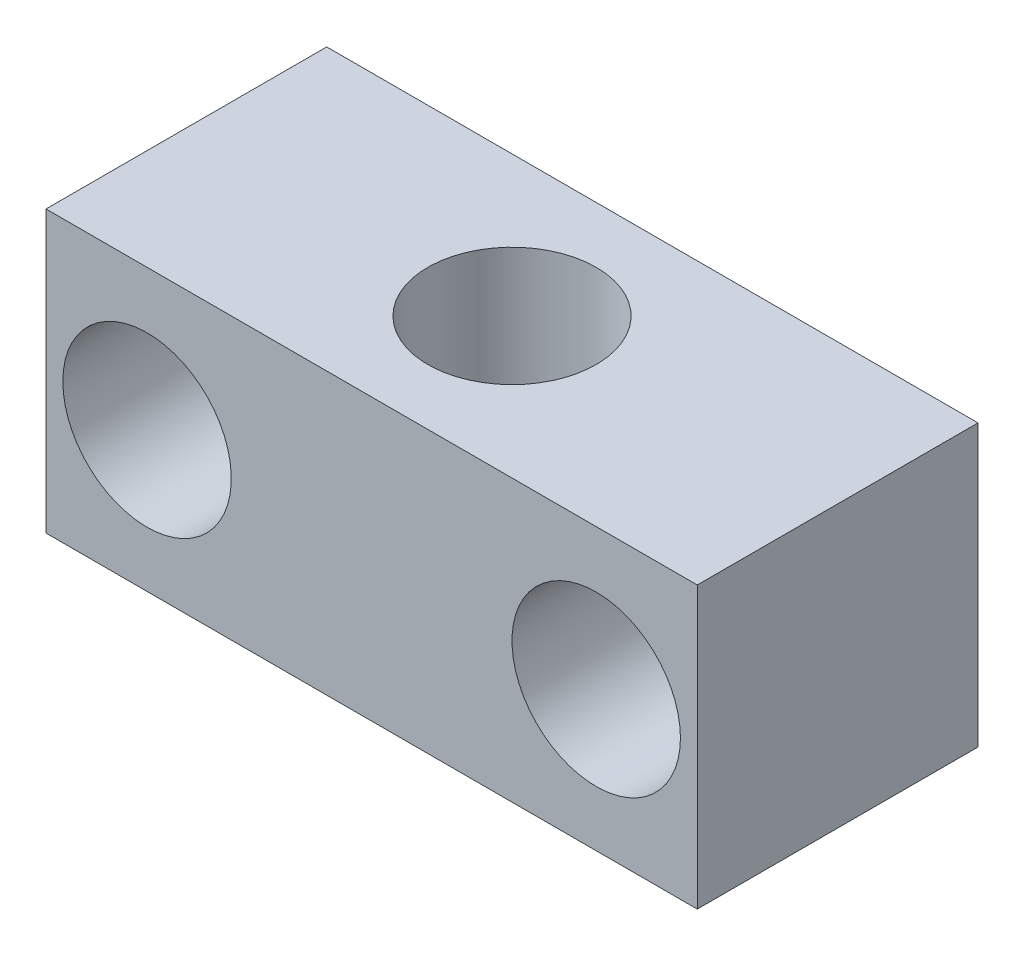
ISO-10303-21;
HEADER;
FILE_DESCRIPTION(('STEP AP214'),'2;1');
FILE_NAME('part.step','',(''),(''),'','','');
FILE_SCHEMA(('AUTOMOTIVE_DESIGN { 1 0 10303 214 1 1 1 1 }'));
ENDSEC;
DATA;
#1=APPLICATION_CONTEXT('core data for automotive mechanical design processes');
#2=APPLICATION_PROTOCOL_DEFINITION('international standard','automotive_design',2000,#1);
#3=PRODUCT_CONTEXT('',#1,'mechanical');
#4=PRODUCT('Part','Part','',(#3));
#5=PRODUCT_RELATED_PRODUCT_CATEGORY('part','',(#4));
#6=PRODUCT_DEFINITION_FORMATION('','',#4);
#7=PRODUCT_DEFINITION_CONTEXT('part definition',#1,'design');
#8=PRODUCT_DEFINITION('design','',#6,#7);
#9=PRODUCT_DEFINITION_SHAPE('','',#8);
#10=(LENGTH_UNIT() NAMED_UNIT(*) SI_UNIT(.MILLI.,.METRE.));
#11=(NAMED_UNIT(*) PLANE_ANGLE_UNIT() SI_UNIT($,.RADIAN.));
#12=(NAMED_UNIT(*) SI_UNIT($,.STERADIAN.) SOLID_ANGLE_UNIT());
#13=UNCERTAINTY_MEASURE_WITH_UNIT(LENGTH_MEASURE(1.E-05),#10,'distance_accuracy_value','');
#14=(GEOMETRIC_REPRESENTATION_CONTEXT(3) GLOBAL_UNCERTAINTY_ASSIGNED_CONTEXT((#13)) GLOBAL_UNIT_ASSIGNED_CONTEXT((#10,
#11,#12)) REPRESENTATION_CONTEXT('',''));
#15=CARTESIAN_POINT('',(0.,0.,0.));
#16=DIRECTION('',(0.,0.,1.));
#17=DIRECTION('',(1.,0.,0.));
#18=AXIS2_PLACEMENT_3D('',#15,#16,#17);
#19=CARTESIAN_POINT('',(-12.2697201424439,1.52496163599194,5.));
#20=DIRECTION('',(1.,0.,0.));
#21=DIRECTION('',(0.,0.,-1.));
#22=AXIS2_PLACEMENT_3D('',#19,#20,#21);
#23=PLANE('',#22);
#24=DIRECTION('',(0.,-1.,0.));
#25=VECTOR('',#24,1.);
#26=CARTESIAN_POINT('',(-12.2697201424439,1.52496163599194,0.));
#27=LINE('',#26,#25);
#28=CARTESIAN_POINT('',(-12.2697201424439,1.52496163599194,0.));
#29=VERTEX_POINT('',#28);
#30=CARTESIAN_POINT('',(-12.2697201424439,-3.47503836400806,0.));
#31=VERTEX_POINT('',#30);
#32=EDGE_CURVE('E85',#29,#31,#27,.T.);
#33=ORIENTED_EDGE('',*,*,#32,.T.);
#34=DIRECTION('',(0.,0.,-1.));
#35=VECTOR('',#34,1.);
#36=CARTESIAN_POINT('',(-12.2697201424439,-3.47503836400806,5.));
#37=LINE('',#36,#35);
#38=CARTESIAN_POINT('',(-12.2697201424439,-3.47503836400806,5.));
#39=VERTEX_POINT('',#38);
#40=EDGE_CURVE('E12',#39,#31,#37,.T.);
#41=ORIENTED_EDGE('',*,*,#40,.F.);
#42=DIRECTION('',(0.,-1.,0.));
#43=VECTOR('',#42,1.);
#44=CARTESIAN_POINT('',(-12.2697201424439,1.52496163599194,5.));
#45=LINE('',#44,#43);
#46=CARTESIAN_POINT('',(-12.2697201424439,1.52496163599194,5.));
#47=VERTEX_POINT('',#46);
#48=EDGE_CURVE('E101',#47,#39,#45,.T.);
#49=ORIENTED_EDGE('',*,*,#48,.F.);
#50=DIRECTION('',(0.,0.,-1.));
#51=VECTOR('',#50,1.);
#52=CARTESIAN_POINT('',(-12.2697201424439,1.52496163599194,5.));
#53=LINE('',#52,#51);
#54=EDGE_CURVE('E91',#47,#29,#53,.T.);
#55=ORIENTED_EDGE('',*,*,#54,.T.);
#56=EDGE_LOOP('',(#33,#41,#49,#55));
#57=FACE_BOUND('',#56,.T.);
#58=ADVANCED_FACE('F33',(#57),#23,.F.);
#59=CARTESIAN_POINT('',(-12.4697201424439,-3.47503836400806,5.));
#60=DIRECTION('',(0.,1.,0.));
#61=DIRECTION('',(0.,0.,1.));
#62=AXIS2_PLACEMENT_3D('',#59,#60,#61);
#63=PLANE('',#62);
#64=CARTESIAN_POINT('',(-6.4697201424439,-3.47503836400806,2.5));
#65=DIRECTION('',(0.,-1.,0.));
#66=DIRECTION('',(0.,0.,-1.));
#67=AXIS2_PLACEMENT_3D('',#64,#65,#66);
#68=CIRCLE('',#67,1.5);
#69=CARTESIAN_POINT('',(-6.4697201424439,-3.47503836400806,0.999999999999999));
#70=VERTEX_POINT('',#69);
#71=EDGE_CURVE('E95',#70,#70,#68,.T.);
#72=ORIENTED_EDGE('',*,*,#71,.F.);
#73=EDGE_LOOP('',(#72));
#74=FACE_BOUND('',#73,.T.);
#75=DIRECTION('',(1.,0.,0.));
#76=VECTOR('',#75,1.);
#77=CARTESIAN_POINT('',(-12.4697201424439,-3.47503836400806,0.));
#78=LINE('',#77,#76);
#79=CARTESIAN_POINT('',(-0.669720142443896,-3.47503836400806,0.));
#80=VERTEX_POINT('',#79);
#81=EDGE_CURVE('E80',#31,#80,#78,.T.);
#82=ORIENTED_EDGE('',*,*,#81,.T.);
#83=DIRECTION('',(0.,0.,-1.));
#84=VECTOR('',#83,1.);
#85=CARTESIAN_POINT('',(-0.669720142443895,-3.47503836400806,5.));
#86=LINE('',#85,#84);
#87=CARTESIAN_POINT('',(-0.669720142443896,-3.47503836400806,5.));
#88=VERTEX_POINT('',#87);
#89=EDGE_CURVE('E41',#88,#80,#86,.T.);
#90=ORIENTED_EDGE('',*,*,#89,.F.);
#91=DIRECTION('',(1.,0.,0.));
#92=VECTOR('',#91,1.);
#93=CARTESIAN_POINT('',(-12.4697201424439,-3.47503836400806,5.));
#94=LINE('',#93,#92);
#95=EDGE_CURVE('E61',#39,#88,#94,.T.);
#96=ORIENTED_EDGE('',*,*,#95,.F.);
#97=ORIENTED_EDGE('',*,*,#40,.T.);
#98=EDGE_LOOP('',(#82,#90,#96,#97));
#99=FACE_BOUND('',#98,.T.);
#100=ADVANCED_FACE('F88',(#74,#99),#63,.F.);
#101=CARTESIAN_POINT('',(-0.669720142443896,1.52496163599194,5.));
#102=DIRECTION('',(-1.,0.,0.));
#103=DIRECTION('',(0.,-1.,0.));
#104=AXIS2_PLACEMENT_3D('',#101,#102,#103);
#105=PLANE('',#104);
#106=DIRECTION('',(0.,1.,0.));
#107=VECTOR('',#106,1.);
#108=CARTESIAN_POINT('',(-0.669720142443896,1.52496163599194,0.));
#109=LINE('',#108,#107);
#110=CARTESIAN_POINT('',(-0.669720142443896,1.52496163599194,0.));
#111=VERTEX_POINT('',#110);
#112=EDGE_CURVE('E76',#80,#111,#109,.T.);
#113=ORIENTED_EDGE('',*,*,#112,.T.);
#114=DIRECTION('',(0.,0.,-1.));
#115=VECTOR('',#114,1.);
#116=CARTESIAN_POINT('',(-0.669720142443896,1.52496163599194,5.));
#117=LINE('',#116,#115);
#118=CARTESIAN_POINT('',(-0.669720142443896,1.52496163599194,5.));
#119=VERTEX_POINT('',#118);
#120=EDGE_CURVE('E99',#119,#111,#117,.T.);
#121=ORIENTED_EDGE('',*,*,#120,.F.);
#122=DIRECTION('',(0.,1.,0.));
#123=VECTOR('',#122,1.);
#124=CARTESIAN_POINT('',(-0.669720142443896,1.52496163599194,5.));
#125=LINE('',#124,#123);
#126=EDGE_CURVE('E102',#88,#119,#125,.T.);
#127=ORIENTED_EDGE('',*,*,#126,.F.);
#128=ORIENTED_EDGE('',*,*,#89,.T.);
#129=EDGE_LOOP('',(#113,#121,#127,#128));
#130=FACE_BOUND('',#129,.T.);
#131=ADVANCED_FACE('F155',(#130),#105,.F.);
#132=CARTESIAN_POINT('',(-12.4697201424439,1.52496163599194,5.));
#133=DIRECTION('',(0.,-1.,0.));
#134=DIRECTION('',(0.,0.,-1.));
#135=AXIS2_PLACEMENT_3D('',#132,#133,#134);
#136=PLANE('',#135);
#137=CARTESIAN_POINT('',(-6.4697201424439,1.52496163599194,2.5));
#138=DIRECTION('',(0.,-1.,0.));
#139=DIRECTION('',(0.,0.,-1.));
#140=AXIS2_PLACEMENT_3D('',#137,#138,#139);
#141=CIRCLE('',#140,1.5);
#142=CARTESIAN_POINT('',(-6.4697201424439,1.52496163599194,0.999999999999999));
#143=VERTEX_POINT('',#142);
#144=EDGE_CURVE('E92',#143,#143,#141,.T.);
#145=ORIENTED_EDGE('',*,*,#144,.T.);
#146=EDGE_LOOP('',(#145));
#147=FACE_BOUND('',#146,.T.);
#148=DIRECTION('',(-1.,0.,0.));
#149=VECTOR('',#148,1.);
#150=CARTESIAN_POINT('',(-12.4697201424439,1.52496163599194,0.));
#151=LINE('',#150,#149);
#152=EDGE_CURVE('E68',#111,#29,#151,.T.);
#153=ORIENTED_EDGE('',*,*,#152,.T.);
#154=ORIENTED_EDGE('',*,*,#54,.F.);
#155=DIRECTION('',(-1.,0.,0.));
#156=VECTOR('',#155,1.);
#157=CARTESIAN_POINT('',(-12.4697201424439,1.52496163599194,5.));
#158=LINE('',#157,#156);
#159=EDGE_CURVE('E49',#119,#47,#158,.T.);
#160=ORIENTED_EDGE('',*,*,#159,.F.);
#161=ORIENTED_EDGE('',*,*,#120,.T.);
#162=EDGE_LOOP('',(#153,#154,#160,#161));
#163=FACE_BOUND('',#162,.T.);
#164=ADVANCED_FACE('F161',(#147,#163),#136,.F.);
#165=CARTESIAN_POINT('',(0.,0.,5.));
#166=DIRECTION('',(0.,0.,1.));
#167=DIRECTION('',(1.,0.,0.));
#168=AXIS2_PLACEMENT_3D('',#165,#166,#167);
#169=PLANE('',#168);
#170=CARTESIAN_POINT('',(-10.4697201424439,-0.984437849979258,5.));
#171=DIRECTION('',(0.,0.,-1.));
#172=DIRECTION('',(-1.,0.,0.));
#173=AXIS2_PLACEMENT_3D('',#170,#171,#172);
#174=CIRCLE('',#173,1.5);
#175=CARTESIAN_POINT('',(-11.9697201424439,-0.984437849979258,5.));
#176=VERTEX_POINT('',#175);
#177=EDGE_CURVE('E111',#176,#176,#174,.T.);
#178=ORIENTED_EDGE('',*,*,#177,.T.);
#179=EDGE_LOOP('',(#178));
#180=FACE_BOUND('',#179,.T.);
#181=CARTESIAN_POINT('',(-2.4697201424439,-0.984437849979261,5.));
#182=DIRECTION('',(0.,0.,-1.));
#183=DIRECTION('',(1.,0.,0.));
#184=AXIS2_PLACEMENT_3D('',#181,#182,#183);
#185=CIRCLE('',#184,1.5);
#186=CARTESIAN_POINT('',(-0.969720142443898,-0.984437849979261,5.));
#187=VERTEX_POINT('',#186);
#188=EDGE_CURVE('E116',#187,#187,#185,.T.);
#189=ORIENTED_EDGE('',*,*,#188,.T.);
#190=EDGE_LOOP('',(#189));
#191=FACE_BOUND('',#190,.T.);
#192=ORIENTED_EDGE('',*,*,#48,.T.);
#193=ORIENTED_EDGE('',*,*,#95,.T.);
#194=ORIENTED_EDGE('',*,*,#126,.T.);
#195=ORIENTED_EDGE('',*,*,#159,.T.);
#196=EDGE_LOOP('',(#192,#193,#194,#195));
#197=FACE_BOUND('',#196,.T.);
#198=ADVANCED_FACE('F125',(#180,#191,#197),#169,.T.);
#199=CARTESIAN_POINT('',(0.,0.,0.));
#200=DIRECTION('',(0.,0.,1.));
#201=DIRECTION('',(1.,0.,0.));
#202=AXIS2_PLACEMENT_3D('',#199,#200,#201);
#203=PLANE('',#202);
#204=CARTESIAN_POINT('',(-10.4697201424439,-0.984437849979258,0.));
#205=DIRECTION('',(0.,0.,-1.));
#206=DIRECTION('',(-1.,0.,0.));
#207=AXIS2_PLACEMENT_3D('',#204,#205,#206);
#208=CIRCLE('',#207,1.5);
#209=CARTESIAN_POINT('',(-11.9697201424439,-0.984437849979258,0.));
#210=VERTEX_POINT('',#209);
#211=EDGE_CURVE('E119',#210,#210,#208,.T.);
#212=ORIENTED_EDGE('',*,*,#211,.F.);
#213=EDGE_LOOP('',(#212));
#214=FACE_BOUND('',#213,.T.);
#215=CARTESIAN_POINT('',(-2.4697201424439,-0.984437849979261,0.));
#216=DIRECTION('',(0.,0.,-1.));
#217=DIRECTION('',(1.,0.,0.));
#218=AXIS2_PLACEMENT_3D('',#215,#216,#217);
#219=CIRCLE('',#218,1.5);
#220=CARTESIAN_POINT('',(-0.969720142443898,-0.984437849979261,0.));
#221=VERTEX_POINT('',#220);
#222=EDGE_CURVE('E113',#221,#221,#219,.T.);
#223=ORIENTED_EDGE('',*,*,#222,.F.);
#224=EDGE_LOOP('',(#223));
#225=FACE_BOUND('',#224,.T.);
#226=ORIENTED_EDGE('',*,*,#32,.F.);
#227=ORIENTED_EDGE('',*,*,#152,.F.);
#228=ORIENTED_EDGE('',*,*,#112,.F.);
#229=ORIENTED_EDGE('',*,*,#81,.F.);
#230=EDGE_LOOP('',(#226,#227,#228,#229));
#231=FACE_BOUND('',#230,.T.);
#232=ADVANCED_FACE('F83',(#214,#225,#231),#203,.F.);
#233=CARTESIAN_POINT('',(-6.4697201424439,1.52496163599194,2.5));
#234=DIRECTION('',(0.,-1.,0.));
#235=DIRECTION('',(0.,0.,-1.));
#236=AXIS2_PLACEMENT_3D('',#233,#234,#235);
#237=CYLINDRICAL_SURFACE('',#236,1.5);
#238=ORIENTED_EDGE('',*,*,#144,.F.);
#239=EDGE_LOOP('',(#238));
#240=FACE_BOUND('',#239,.T.);
#241=ORIENTED_EDGE('',*,*,#71,.T.);
#242=EDGE_LOOP('',(#241));
#243=FACE_BOUND('',#242,.T.);
#244=ADVANCED_FACE('F137',(#240,#243),#237,.F.);
#245=CARTESIAN_POINT('',(-2.4697201424439,-0.984437849979261,5.));
#246=DIRECTION('',(0.,0.,-1.));
#247=DIRECTION('',(-1.,0.,0.));
#248=AXIS2_PLACEMENT_3D('',#245,#246,#247);
#249=CYLINDRICAL_SURFACE('',#248,1.5);
#250=ORIENTED_EDGE('',*,*,#188,.F.);
#251=EDGE_LOOP('',(#250));
#252=FACE_BOUND('',#251,.T.);
#253=ORIENTED_EDGE('',*,*,#222,.T.);
#254=EDGE_LOOP('',(#253));
#255=FACE_BOUND('',#254,.T.);
#256=ADVANCED_FACE('F131',(#252,#255),#249,.F.);
#257=CARTESIAN_POINT('',(-10.4697201424439,-0.984437849979258,5.));
#258=DIRECTION('',(0.,0.,-1.));
#259=DIRECTION('',(-1.,0.,0.));
#260=AXIS2_PLACEMENT_3D('',#257,#258,#259);
#261=CYLINDRICAL_SURFACE('',#260,1.5);
#262=ORIENTED_EDGE('',*,*,#177,.F.);
#263=EDGE_LOOP('',(#262));
#264=FACE_BOUND('',#263,.T.);
#265=ORIENTED_EDGE('',*,*,#211,.T.);
#266=EDGE_LOOP('',(#265));
#267=FACE_BOUND('',#266,.T.);
#268=ADVANCED_FACE('F128',(#264,#267),#261,.F.);
#269=CLOSED_SHELL('',(#58,#100,#131,#164,#198,#232,#244,#256,#268));
#270=MANIFOLD_SOLID_BREP('B2',#269);
#271=ADVANCED_BREP_SHAPE_REPRESENTATION('',(#18,#270),#14);
#272=SHAPE_DEFINITION_REPRESENTATION(#9,#271);
ENDSEC;
END-ISO-10303-21;
